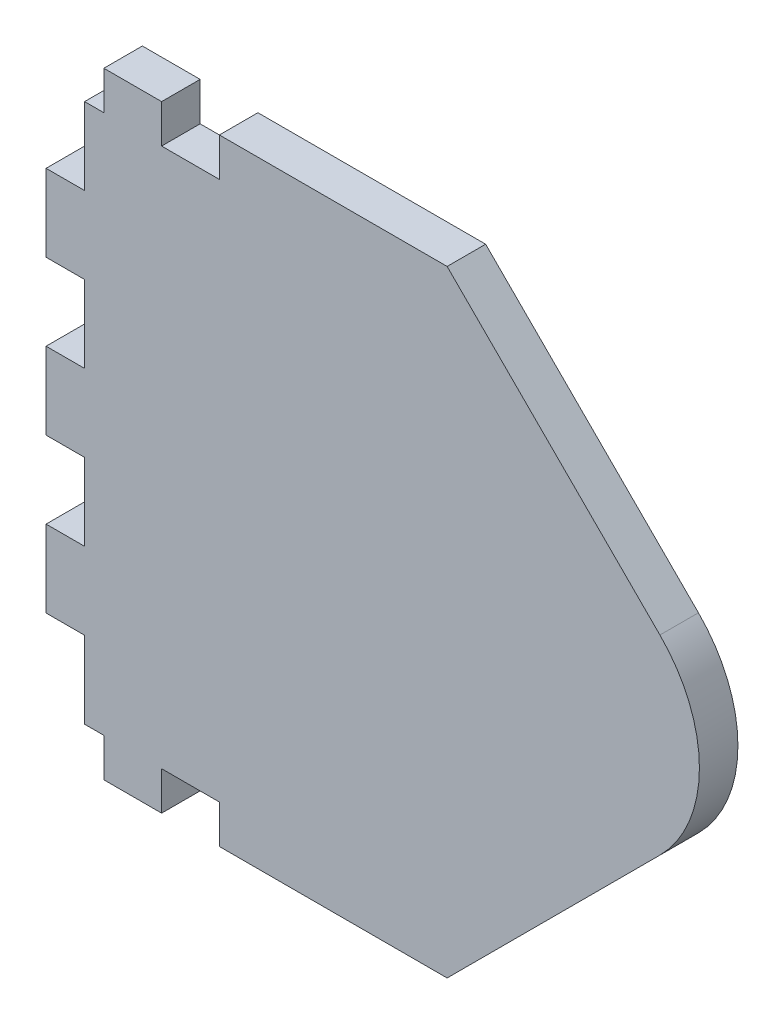
ISO-10303-21;
HEADER;
FILE_DESCRIPTION(('STEP AP214'),'2;1');
FILE_NAME('part.step','',(''),(''),'','','');
FILE_SCHEMA(('AUTOMOTIVE_DESIGN { 1 0 10303 214 1 1 1 1 }'));
ENDSEC;
DATA;
#1=APPLICATION_CONTEXT('core data for automotive mechanical design processes');
#2=APPLICATION_PROTOCOL_DEFINITION('international standard','automotive_design',2000,#1);
#3=PRODUCT_CONTEXT('',#1,'mechanical');
#4=PRODUCT('Part','Part','',(#3));
#5=PRODUCT_RELATED_PRODUCT_CATEGORY('part','',(#4));
#6=PRODUCT_DEFINITION_FORMATION('','',#4);
#7=PRODUCT_DEFINITION_CONTEXT('part definition',#1,'design');
#8=PRODUCT_DEFINITION('design','',#6,#7);
#9=PRODUCT_DEFINITION_SHAPE('','',#8);
#10=(LENGTH_UNIT() NAMED_UNIT(*) SI_UNIT(.MILLI.,.METRE.));
#11=(NAMED_UNIT(*) PLANE_ANGLE_UNIT() SI_UNIT($,.RADIAN.));
#12=(NAMED_UNIT(*) SI_UNIT($,.STERADIAN.) SOLID_ANGLE_UNIT());
#13=UNCERTAINTY_MEASURE_WITH_UNIT(LENGTH_MEASURE(1.E-05),#10,'distance_accuracy_value','');
#14=(GEOMETRIC_REPRESENTATION_CONTEXT(3) GLOBAL_UNCERTAINTY_ASSIGNED_CONTEXT((#13)) GLOBAL_UNIT_ASSIGNED_CONTEXT((#10,
#11,#12)) REPRESENTATION_CONTEXT('',''));
#15=CARTESIAN_POINT('',(0.,0.,0.));
#16=DIRECTION('',(0.,0.,1.));
#17=DIRECTION('',(1.,0.,0.));
#18=AXIS2_PLACEMENT_3D('',#15,#16,#17);
#19=CARTESIAN_POINT('',(-19.049999999964,-37.5475411549447,-6.35));
#20=DIRECTION('',(-1.,0.,0.));
#21=DIRECTION('',(0.,0.,1.));
#22=AXIS2_PLACEMENT_3D('',#19,#20,#21);
#23=PLANE('',#22);
#24=DIRECTION('',(0.,-1.,0.));
#25=VECTOR('',#24,1.);
#26=CARTESIAN_POINT('',(-19.049999999964,-37.5475411549447,0.));
#27=LINE('',#26,#25);
#28=CARTESIAN_POINT('',(-19.0499999978605,-81.9975411549452,0.));
#29=VERTEX_POINT('',#28);
#30=CARTESIAN_POINT('',(-19.0499999978605,-94.6975411549452,0.));
#31=VERTEX_POINT('',#30);
#32=EDGE_CURVE('E311',#29,#31,#27,.T.);
#33=ORIENTED_EDGE('',*,*,#32,.F.);
#34=DIRECTION('',(0.,0.,-1.));
#35=VECTOR('',#34,1.);
#36=CARTESIAN_POINT('',(-19.0499999978605,-81.9975411549452,-12.7));
#37=LINE('',#36,#35);
#38=CARTESIAN_POINT('',(-19.0499999978605,-81.9975411549452,-6.35000000000001));
#39=VERTEX_POINT('',#38);
#40=EDGE_CURVE('E458',#29,#39,#37,.T.);
#41=ORIENTED_EDGE('',*,*,#40,.T.);
#42=DIRECTION('',(0.,-1.,0.));
#43=VECTOR('',#42,1.);
#44=CARTESIAN_POINT('',(-19.049999999964,-37.5475411549447,-6.35));
#45=LINE('',#44,#43);
#46=CARTESIAN_POINT('',(-19.0499999978605,-94.6975411549452,-6.35000000000001));
#47=VERTEX_POINT('',#46);
#48=EDGE_CURVE('E335',#39,#47,#45,.T.);
#49=ORIENTED_EDGE('',*,*,#48,.T.);
#50=DIRECTION('',(0.,0.,1.));
#51=VECTOR('',#50,1.);
#52=CARTESIAN_POINT('',(-19.0499999978605,-94.6975411549452,41.275));
#53=LINE('',#52,#51);
#54=EDGE_CURVE('E440',#47,#31,#53,.T.);
#55=ORIENTED_EDGE('',*,*,#54,.T.);
#56=EDGE_LOOP('',(#33,#41,#49,#55));
#57=FACE_BOUND('',#56,.T.);
#58=ADVANCED_FACE('F33',(#57),#23,.T.);
#59=CARTESIAN_POINT('',(-19.049999999964,-56.5975411549452,0.));
#60=VERTEX_POINT('',#59);
#61=CARTESIAN_POINT('',(-19.0499999978605,-69.2975411549452,0.));
#62=VERTEX_POINT('',#61);
#63=EDGE_CURVE('E313',#60,#62,#27,.T.);
#64=ORIENTED_EDGE('',*,*,#63,.F.);
#65=DIRECTION('',(0.,0.,-1.));
#66=VECTOR('',#65,1.);
#67=CARTESIAN_POINT('',(-19.0499999978605,-56.5975411549452,-12.7));
#68=LINE('',#67,#66);
#69=CARTESIAN_POINT('',(-19.0499999978605,-56.5975411549452,-6.35000000000001));
#70=VERTEX_POINT('',#69);
#71=EDGE_CURVE('E473',#60,#70,#68,.T.);
#72=ORIENTED_EDGE('',*,*,#71,.T.);
#73=CARTESIAN_POINT('',(-19.0499999978605,-69.2975411549452,-6.35000000000001));
#74=VERTEX_POINT('',#73);
#75=EDGE_CURVE('E337',#70,#74,#45,.T.);
#76=ORIENTED_EDGE('',*,*,#75,.T.);
#77=DIRECTION('',(0.,0.,1.));
#78=VECTOR('',#77,1.);
#79=CARTESIAN_POINT('',(-19.0499999978605,-69.2975411549452,41.275));
#80=LINE('',#79,#78);
#81=EDGE_CURVE('E438',#74,#62,#80,.T.);
#82=ORIENTED_EDGE('',*,*,#81,.T.);
#83=EDGE_LOOP('',(#64,#72,#76,#82));
#84=FACE_BOUND('',#83,.T.);
#85=ADVANCED_FACE('F520',(#84),#23,.T.);
#86=CARTESIAN_POINT('',(-19.049999999964,-107.397541154945,0.));
#87=VERTEX_POINT('',#86);
#88=CARTESIAN_POINT('',(-19.0499999978604,-120.097541154945,0.));
#89=VERTEX_POINT('',#88);
#90=EDGE_CURVE('E309',#87,#89,#27,.T.);
#91=ORIENTED_EDGE('',*,*,#90,.F.);
#92=DIRECTION('',(0.,0.,-1.));
#93=VECTOR('',#92,1.);
#94=CARTESIAN_POINT('',(-19.0499999978605,-107.397541154945,-12.7));
#95=LINE('',#94,#93);
#96=CARTESIAN_POINT('',(-19.0499999978605,-107.397541154945,-6.35000000000001));
#97=VERTEX_POINT('',#96);
#98=EDGE_CURVE('E234',#87,#97,#95,.T.);
#99=ORIENTED_EDGE('',*,*,#98,.T.);
#100=CARTESIAN_POINT('',(-19.0499999978604,-120.097541154945,-6.35000000000001));
#101=VERTEX_POINT('',#100);
#102=EDGE_CURVE('E329',#97,#101,#45,.T.);
#103=ORIENTED_EDGE('',*,*,#102,.T.);
#104=DIRECTION('',(0.,0.,1.));
#105=VECTOR('',#104,1.);
#106=CARTESIAN_POINT('',(-19.0499999978604,-120.097541154945,41.275));
#107=LINE('',#106,#105);
#108=EDGE_CURVE('E436',#101,#89,#107,.T.);
#109=ORIENTED_EDGE('',*,*,#108,.T.);
#110=EDGE_LOOP('',(#91,#99,#103,#109));
#111=FACE_BOUND('',#110,.T.);
#112=ADVANCED_FACE('F490',(#111),#23,.T.);
#113=CARTESIAN_POINT('',(-19.049999999964,-37.5475411549447,-6.35));
#114=DIRECTION('',(0.,-1.,0.));
#115=DIRECTION('',(1.,0.,0.));
#116=AXIS2_PLACEMENT_3D('',#113,#114,#115);
#117=PLANE('',#116);
#118=DIRECTION('',(0.,0.,1.));
#119=VECTOR('',#118,1.);
#120=CARTESIAN_POINT('',(9.52499999972772,-37.5475411549448,-6.35000000000001));
#121=LINE('',#120,#119);
#122=CARTESIAN_POINT('',(9.52499999972772,-37.5475411549448,-6.35000000000001));
#123=VERTEX_POINT('',#122);
#124=CARTESIAN_POINT('',(9.52499999972772,-37.5475411549448,0.));
#125=VERTEX_POINT('',#124);
#126=EDGE_CURVE('E409',#123,#125,#121,.T.);
#127=ORIENTED_EDGE('',*,*,#126,.T.);
#128=DIRECTION('',(1.,0.,0.));
#129=VECTOR('',#128,1.);
#130=CARTESIAN_POINT('',(-19.049999999964,-37.5475411549447,0.));
#131=LINE('',#130,#129);
#132=CARTESIAN_POINT('',(47.0725411549534,-37.5475411549446,0.));
#133=VERTEX_POINT('',#132);
#134=EDGE_CURVE('E288',#125,#133,#131,.T.);
#135=ORIENTED_EDGE('',*,*,#134,.T.);
#136=DIRECTION('',(0.,0.,1.));
#137=VECTOR('',#136,1.);
#138=CARTESIAN_POINT('',(47.0725411549534,-37.5475411549446,-6.35));
#139=LINE('',#138,#137);
#140=CARTESIAN_POINT('',(47.0725411549534,-37.5475411549446,-6.35));
#141=VERTEX_POINT('',#140);
#142=EDGE_CURVE('E274',#141,#133,#139,.T.);
#143=ORIENTED_EDGE('',*,*,#142,.F.);
#144=DIRECTION('',(1.,0.,0.));
#145=VECTOR('',#144,1.);
#146=CARTESIAN_POINT('',(-19.049999999964,-37.5475411549447,-6.35));
#147=LINE('',#146,#145);
#148=EDGE_CURVE('E299',#123,#141,#147,.T.);
#149=ORIENTED_EDGE('',*,*,#148,.F.);
#150=EDGE_LOOP('',(#127,#135,#143,#149));
#151=FACE_BOUND('',#150,.T.);
#152=ADVANCED_FACE('F516',(#151),#117,.F.);
#153=DIRECTION('',(0.,0.,-1.));
#154=VECTOR('',#153,1.);
#155=CARTESIAN_POINT('',(-2.72275257895416E-10,-37.5475411549447,-12.7));
#156=LINE('',#155,#154);
#157=CARTESIAN_POINT('',(-2.72289135683224E-10,-37.5475411549447,0.));
#158=VERTEX_POINT('',#157);
#159=CARTESIAN_POINT('',(-2.72275257895416E-10,-37.5475411549447,-6.35000000000001));
#160=VERTEX_POINT('',#159);
#161=EDGE_CURVE('E428',#158,#160,#156,.T.);
#162=ORIENTED_EDGE('',*,*,#161,.T.);
#163=CARTESIAN_POINT('',(-9.52500000027229,-37.5475411549447,-6.35000000000001));
#164=VERTEX_POINT('',#163);
#165=EDGE_CURVE('E293',#164,#160,#147,.T.);
#166=ORIENTED_EDGE('',*,*,#165,.F.);
#167=DIRECTION('',(0.,0.,-1.));
#168=VECTOR('',#167,1.);
#169=CARTESIAN_POINT('',(-9.52500000027231,-37.5475411549447,23.8125));
#170=LINE('',#169,#168);
#171=CARTESIAN_POINT('',(-9.52500000027229,-37.5475411549447,0.));
#172=VERTEX_POINT('',#171);
#173=EDGE_CURVE('E404',#172,#164,#170,.T.);
#174=ORIENTED_EDGE('',*,*,#173,.F.);
#175=EDGE_CURVE('E324',#172,#158,#131,.T.);
#176=ORIENTED_EDGE('',*,*,#175,.T.);
#177=EDGE_LOOP('',(#162,#166,#174,#176));
#178=FACE_BOUND('',#177,.T.);
#179=ADVANCED_FACE('F511',(#178),#117,.F.);
#180=CARTESIAN_POINT('',(-19.049999999964,-139.147541154945,-6.35));
#181=DIRECTION('',(0.,-1.,0.));
#182=DIRECTION('',(1.,0.,0.));
#183=AXIS2_PLACEMENT_3D('',#180,#181,#182);
#184=PLANE('',#183);
#185=DIRECTION('',(1.,0.,0.));
#186=VECTOR('',#185,1.);
#187=CARTESIAN_POINT('',(-19.049999999964,-139.147541154945,0.));
#188=LINE('',#187,#186);
#189=CARTESIAN_POINT('',(9.52499999972763,-139.147541154945,0.));
#190=VERTEX_POINT('',#189);
#191=CARTESIAN_POINT('',(47.0725411549534,-139.147541154945,0.));
#192=VERTEX_POINT('',#191);
#193=EDGE_CURVE('E314',#190,#192,#188,.T.);
#194=ORIENTED_EDGE('',*,*,#193,.F.);
#195=DIRECTION('',(0.,0.,1.));
#196=VECTOR('',#195,1.);
#197=CARTESIAN_POINT('',(9.52499999972763,-139.147541154945,-6.34999999999999));
#198=LINE('',#197,#196);
#199=CARTESIAN_POINT('',(9.52499999972763,-139.147541154945,-6.34999999999999));
#200=VERTEX_POINT('',#199);
#201=EDGE_CURVE('E377',#200,#190,#198,.T.);
#202=ORIENTED_EDGE('',*,*,#201,.F.);
#203=DIRECTION('',(1.,0.,0.));
#204=VECTOR('',#203,1.);
#205=CARTESIAN_POINT('',(-19.049999999964,-139.147541154945,-6.35));
#206=LINE('',#205,#204);
#207=CARTESIAN_POINT('',(47.0725411549534,-139.147541154945,-6.35));
#208=VERTEX_POINT('',#207);
#209=EDGE_CURVE('E345',#200,#208,#206,.T.);
#210=ORIENTED_EDGE('',*,*,#209,.T.);
#211=DIRECTION('',(0.,0.,1.));
#212=VECTOR('',#211,1.);
#213=CARTESIAN_POINT('',(47.0725411549534,-139.147541154945,-6.35));
#214=LINE('',#213,#212);
#215=EDGE_CURVE('E291',#208,#192,#214,.T.);
#216=ORIENTED_EDGE('',*,*,#215,.T.);
#217=EDGE_LOOP('',(#194,#202,#210,#216));
#218=FACE_BOUND('',#217,.T.);
#219=ADVANCED_FACE('F509',(#218),#184,.T.);
#220=CARTESIAN_POINT('',(-9.52500000027237,-139.147541154945,-6.35));
#221=VERTEX_POINT('',#220);
#222=CARTESIAN_POINT('',(-2.72365463516167E-10,-139.147541154945,-6.35));
#223=VERTEX_POINT('',#222);
#224=EDGE_CURVE('E350',#221,#223,#206,.T.);
#225=ORIENTED_EDGE('',*,*,#224,.T.);
#226=DIRECTION('',(0.,0.,-1.));
#227=VECTOR('',#226,1.);
#228=CARTESIAN_POINT('',(-2.72365463516167E-10,-139.147541154945,-12.7));
#229=LINE('',#228,#227);
#230=CARTESIAN_POINT('',(-2.72365463516167E-10,-139.147541154945,0.));
#231=VERTEX_POINT('',#230);
#232=EDGE_CURVE('E399',#231,#223,#229,.T.);
#233=ORIENTED_EDGE('',*,*,#232,.F.);
#234=CARTESIAN_POINT('',(-9.52500000027238,-139.147541154945,0.));
#235=VERTEX_POINT('',#234);
#236=EDGE_CURVE('E316',#235,#231,#188,.T.);
#237=ORIENTED_EDGE('',*,*,#236,.F.);
#238=DIRECTION('',(0.,0.,1.));
#239=VECTOR('',#238,1.);
#240=CARTESIAN_POINT('',(-9.52500000027237,-139.147541154945,-12.7));
#241=LINE('',#240,#239);
#242=EDGE_CURVE('E395',#221,#235,#241,.T.);
#243=ORIENTED_EDGE('',*,*,#242,.F.);
#244=EDGE_LOOP('',(#225,#233,#237,#243));
#245=FACE_BOUND('',#244,.T.);
#246=ADVANCED_FACE('F504',(#245),#184,.T.);
#247=CARTESIAN_POINT('',(66.441644731211,-88.3475411549445,-6.35));
#248=DIRECTION('',(0.,0.,1.));
#249=DIRECTION('',(1.,0.,0.));
#250=AXIS2_PLACEMENT_3D('',#247,#248,#249);
#251=PLANE('',#250);
#252=DIRECTION('',(0.,1.,0.));
#253=VECTOR('',#252,1.);
#254=CARTESIAN_POINT('',(9.52499999972763,-139.147541154945,-6.34999999999999));
#255=LINE('',#254,#253);
#256=CARTESIAN_POINT('',(9.52499999972764,-132.797541154945,-6.34999999999999));
#257=VERTEX_POINT('',#256);
#258=EDGE_CURVE('E372',#200,#257,#255,.T.);
#259=ORIENTED_EDGE('',*,*,#258,.T.);
#260=DIRECTION('',(1.,0.,0.));
#261=VECTOR('',#260,1.);
#262=CARTESIAN_POINT('',(-19.0500000002724,-132.797541154945,-6.35));
#263=LINE('',#262,#261);
#264=CARTESIAN_POINT('',(-2.72358524622263E-10,-132.797541154945,-6.35));
#265=VERTEX_POINT('',#264);
#266=EDGE_CURVE('E374',#265,#257,#263,.T.);
#267=ORIENTED_EDGE('',*,*,#266,.F.);
#268=DIRECTION('',(0.,1.,0.));
#269=VECTOR('',#268,1.);
#270=CARTESIAN_POINT('',(-2.72365463516167E-10,-139.147541154945,-6.34999999999999));
#271=LINE('',#270,#269);
#272=EDGE_CURVE('E386',#223,#265,#271,.T.);
#273=ORIENTED_EDGE('',*,*,#272,.F.);
#274=ORIENTED_EDGE('',*,*,#224,.F.);
#275=DIRECTION('',(0.,-1.,0.));
#276=VECTOR('',#275,1.);
#277=CARTESIAN_POINT('',(-9.52500000027237,-139.147541154945,-6.35));
#278=LINE('',#277,#276);
#279=CARTESIAN_POINT('',(-9.52500000027238,-132.797541154945,-6.35));
#280=VERTEX_POINT('',#279);
#281=EDGE_CURVE('E389',#280,#221,#278,.T.);
#282=ORIENTED_EDGE('',*,*,#281,.F.);
#283=CARTESIAN_POINT('',(-12.6999999978604,-132.797541154945,-6.35));
#284=VERTEX_POINT('',#283);
#285=EDGE_CURVE('E380',#284,#280,#263,.T.);
#286=ORIENTED_EDGE('',*,*,#285,.F.);
#287=DIRECTION('',(0.,1.,0.));
#288=VECTOR('',#287,1.);
#289=CARTESIAN_POINT('',(-12.6999999978604,-139.147541154945,-6.35000000000001));
#290=LINE('',#289,#288);
#291=CARTESIAN_POINT('',(-12.6999999978604,-120.097541154945,-6.35000000000001));
#292=VERTEX_POINT('',#291);
#293=EDGE_CURVE('E443',#284,#292,#290,.T.);
#294=ORIENTED_EDGE('',*,*,#293,.T.);
#295=DIRECTION('',(1.,0.,0.));
#296=VECTOR('',#295,1.);
#297=CARTESIAN_POINT('',(-12.6999999978604,-120.097541154945,-6.35000000000001));
#298=LINE('',#297,#296);
#299=EDGE_CURVE('E239',#101,#292,#298,.T.);
#300=ORIENTED_EDGE('',*,*,#299,.F.);
#301=ORIENTED_EDGE('',*,*,#102,.F.);
#302=DIRECTION('',(-1.,0.,0.));
#303=VECTOR('',#302,1.);
#304=CARTESIAN_POINT('',(-12.6999999978605,-107.397541154945,-6.35000000000001));
#305=LINE('',#304,#303);
#306=CARTESIAN_POINT('',(-12.6999999978605,-107.397541154945,-6.35000000000001));
#307=VERTEX_POINT('',#306);
#308=EDGE_CURVE('E475',#307,#97,#305,.T.);
#309=ORIENTED_EDGE('',*,*,#308,.F.);
#310=CARTESIAN_POINT('',(-12.6999999978605,-94.6975411549452,-6.35000000000001));
#311=VERTEX_POINT('',#310);
#312=EDGE_CURVE('E247',#307,#311,#290,.T.);
#313=ORIENTED_EDGE('',*,*,#312,.T.);
#314=DIRECTION('',(1.,0.,0.));
#315=VECTOR('',#314,1.);
#316=CARTESIAN_POINT('',(-12.6999999978605,-94.6975411549452,-6.35000000000001));
#317=LINE('',#316,#315);
#318=EDGE_CURVE('E450',#47,#311,#317,.T.);
#319=ORIENTED_EDGE('',*,*,#318,.F.);
#320=ORIENTED_EDGE('',*,*,#48,.F.);
#321=DIRECTION('',(-1.,0.,0.));
#322=VECTOR('',#321,1.);
#323=CARTESIAN_POINT('',(-12.6999999978605,-81.9975411549452,-6.35000000000001));
#324=LINE('',#323,#322);
#325=CARTESIAN_POINT('',(-12.6999999978605,-81.9975411549452,-6.35000000000001));
#326=VERTEX_POINT('',#325);
#327=EDGE_CURVE('E447',#326,#39,#324,.T.);
#328=ORIENTED_EDGE('',*,*,#327,.F.);
#329=CARTESIAN_POINT('',(-12.6999999978605,-69.2975411549452,-6.35000000000001));
#330=VERTEX_POINT('',#329);
#331=EDGE_CURVE('E446',#326,#330,#290,.T.);
#332=ORIENTED_EDGE('',*,*,#331,.T.);
#333=DIRECTION('',(1.,0.,0.));
#334=VECTOR('',#333,1.);
#335=CARTESIAN_POINT('',(-12.6999999978605,-69.2975411549452,-6.35000000000001));
#336=LINE('',#335,#334);
#337=EDGE_CURVE('E466',#74,#330,#336,.T.);
#338=ORIENTED_EDGE('',*,*,#337,.F.);
#339=ORIENTED_EDGE('',*,*,#75,.F.);
#340=DIRECTION('',(-1.,0.,0.));
#341=VECTOR('',#340,1.);
#342=CARTESIAN_POINT('',(-12.6999999978605,-56.5975411549452,-6.35000000000001));
#343=LINE('',#342,#341);
#344=CARTESIAN_POINT('',(-12.6999999978605,-56.5975411549452,-6.35000000000001));
#345=VERTEX_POINT('',#344);
#346=EDGE_CURVE('E462',#345,#70,#343,.T.);
#347=ORIENTED_EDGE('',*,*,#346,.F.);
#348=CARTESIAN_POINT('',(-12.6999999978605,-43.8975411549452,-6.35000000000001));
#349=VERTEX_POINT('',#348);
#350=EDGE_CURVE('E449',#345,#349,#290,.T.);
#351=ORIENTED_EDGE('',*,*,#350,.T.);
#352=DIRECTION('',(1.,0.,0.));
#353=VECTOR('',#352,1.);
#354=CARTESIAN_POINT('',(-19.0500000002723,-43.8975411549447,-6.35000000000001));
#355=LINE('',#354,#353);
#356=CARTESIAN_POINT('',(-9.52500000027229,-43.8975411549447,-6.35000000000001));
#357=VERTEX_POINT('',#356);
#358=EDGE_CURVE('E408',#349,#357,#355,.T.);
#359=ORIENTED_EDGE('',*,*,#358,.T.);
#360=DIRECTION('',(0.,-1.,0.));
#361=VECTOR('',#360,1.);
#362=CARTESIAN_POINT('',(-9.52500000027229,-43.8975411549447,-6.35000000000001));
#363=LINE('',#362,#361);
#364=EDGE_CURVE('E419',#164,#357,#363,.T.);
#365=ORIENTED_EDGE('',*,*,#364,.F.);
#366=ORIENTED_EDGE('',*,*,#165,.T.);
#367=DIRECTION('',(0.,1.,0.));
#368=VECTOR('',#367,1.);
#369=CARTESIAN_POINT('',(-2.7228219678932E-10,-43.8975411549447,-6.35));
#370=LINE('',#369,#368);
#371=CARTESIAN_POINT('',(-2.7228219678932E-10,-43.8975411549447,-6.35000000000001));
#372=VERTEX_POINT('',#371);
#373=EDGE_CURVE('E412',#372,#160,#370,.T.);
#374=ORIENTED_EDGE('',*,*,#373,.F.);
#375=CARTESIAN_POINT('',(9.52499999972772,-43.8975411549448,-6.35000000000001));
#376=VERTEX_POINT('',#375);
#377=EDGE_CURVE('E415',#372,#376,#355,.T.);
#378=ORIENTED_EDGE('',*,*,#377,.T.);
#379=DIRECTION('',(0.,1.,0.));
#380=VECTOR('',#379,1.);
#381=CARTESIAN_POINT('',(9.52499999972772,-43.8975411549448,-6.35000000000001));
#382=LINE('',#381,#380);
#383=EDGE_CURVE('E406',#376,#123,#382,.T.);
#384=ORIENTED_EDGE('',*,*,#383,.T.);
#385=ORIENTED_EDGE('',*,*,#148,.T.);
#386=DIRECTION('',(0.707106781186545,-0.70710678118655,0.));
#387=VECTOR('',#386,1.);
#388=CARTESIAN_POINT('',(47.0725411549534,-37.5475411549446,-6.35));
#389=LINE('',#388,#387);
#390=CARTESIAN_POINT('',(82.1570929430826,-72.6320929430741,-6.35));
#391=VERTEX_POINT('',#390);
#392=EDGE_CURVE('E305',#141,#391,#389,.T.);
#393=ORIENTED_EDGE('',*,*,#392,.T.);
#394=CARTESIAN_POINT('',(66.441644731211,-88.3475411549445,-6.35));
#395=DIRECTION('',(0.,0.,1.));
#396=DIRECTION('',(1.,0.,0.));
#397=AXIS2_PLACEMENT_3D('',#394,#395,#396);
#398=CIRCLE('',#397,22.225);
#399=CARTESIAN_POINT('',(82.1570929430821,-104.062989366815,-6.35));
#400=VERTEX_POINT('',#399);
#401=EDGE_CURVE('E357',#400,#391,#398,.T.);
#402=ORIENTED_EDGE('',*,*,#401,.F.);
#403=DIRECTION('',(0.707106781186541,0.707106781186554,0.));
#404=VECTOR('',#403,1.);
#405=CARTESIAN_POINT('',(47.0725411549534,-139.147541154945,-6.35));
#406=LINE('',#405,#404);
#407=EDGE_CURVE('E354',#208,#400,#406,.T.);
#408=ORIENTED_EDGE('',*,*,#407,.F.);
#409=ORIENTED_EDGE('',*,*,#209,.F.);
#410=EDGE_LOOP('',(#259,#267,#273,#274,#282,#286,#294,#300,#301,#309,#313,#319,#320,#328,#332,
#338,#339,#347,#351,#359,#365,#366,#374,#378,#384,#385,#393,#402,#408,#409));
#411=FACE_BOUND('',#410,.T.);
#412=ADVANCED_FACE('F362',(#411),#251,.F.);
#413=CARTESIAN_POINT('',(66.441644731211,-88.3475411549445,0.));
#414=DIRECTION('',(0.,0.,1.));
#415=DIRECTION('',(1.,0.,0.));
#416=AXIS2_PLACEMENT_3D('',#413,#414,#415);
#417=PLANE('',#416);
#418=DIRECTION('',(-1.,0.,0.));
#419=VECTOR('',#418,1.);
#420=CARTESIAN_POINT('',(-12.6999999978604,-120.097541154945,0.));
#421=LINE('',#420,#419);
#422=CARTESIAN_POINT('',(-12.6999999978605,-120.097541154945,0.));
#423=VERTEX_POINT('',#422);
#424=EDGE_CURVE('E240',#423,#89,#421,.T.);
#425=ORIENTED_EDGE('',*,*,#424,.F.);
#426=DIRECTION('',(0.,-1.,0.));
#427=VECTOR('',#426,1.);
#428=CARTESIAN_POINT('',(-12.6999999978605,-88.3475411549446,0.));
#429=LINE('',#428,#427);
#430=CARTESIAN_POINT('',(-12.6999999978604,-132.797541154945,0.));
#431=VERTEX_POINT('',#430);
#432=EDGE_CURVE('E264',#423,#431,#429,.T.);
#433=ORIENTED_EDGE('',*,*,#432,.T.);
#434=DIRECTION('',(1.,0.,0.));
#435=VECTOR('',#434,1.);
#436=CARTESIAN_POINT('',(66.441644731211,-132.797541154945,0.));
#437=LINE('',#436,#435);
#438=CARTESIAN_POINT('',(-9.52500000027237,-132.797541154945,0.));
#439=VERTEX_POINT('',#438);
#440=EDGE_CURVE('E263',#431,#439,#437,.T.);
#441=ORIENTED_EDGE('',*,*,#440,.T.);
#442=DIRECTION('',(0.,1.,0.));
#443=VECTOR('',#442,1.);
#444=CARTESIAN_POINT('',(-9.52500000027238,-139.147541154945,0.));
#445=LINE('',#444,#443);
#446=EDGE_CURVE('E392',#235,#439,#445,.T.);
#447=ORIENTED_EDGE('',*,*,#446,.F.);
#448=ORIENTED_EDGE('',*,*,#236,.T.);
#449=DIRECTION('',(0.,1.,0.));
#450=VECTOR('',#449,1.);
#451=CARTESIAN_POINT('',(-2.72365463516167E-10,-139.147541154945,0.));
#452=LINE('',#451,#450);
#453=CARTESIAN_POINT('',(-2.72361146135585E-10,-132.797541154945,0.));
#454=VERTEX_POINT('',#453);
#455=EDGE_CURVE('E391',#231,#454,#452,.T.);
#456=ORIENTED_EDGE('',*,*,#455,.T.);
#457=CARTESIAN_POINT('',(9.52499999972764,-132.797541154945,0.));
#458=VERTEX_POINT('',#457);
#459=EDGE_CURVE('E40',#454,#458,#437,.T.);
#460=ORIENTED_EDGE('',*,*,#459,.T.);
#461=DIRECTION('',(0.,-1.,0.));
#462=VECTOR('',#461,1.);
#463=CARTESIAN_POINT('',(9.52499999972767,-88.3475411549444,0.));
#464=LINE('',#463,#462);
#465=EDGE_CURVE('E11',#458,#190,#464,.T.);
#466=ORIENTED_EDGE('',*,*,#465,.T.);
#467=ORIENTED_EDGE('',*,*,#193,.T.);
#468=DIRECTION('',(0.707106781186541,0.707106781186554,0.));
#469=VECTOR('',#468,1.);
#470=CARTESIAN_POINT('',(47.0725411549534,-139.147541154945,0.));
#471=LINE('',#470,#469);
#472=CARTESIAN_POINT('',(82.1570929430821,-104.062989366815,0.));
#473=VERTEX_POINT('',#472);
#474=EDGE_CURVE('E317',#192,#473,#471,.T.);
#475=ORIENTED_EDGE('',*,*,#474,.T.);
#476=CARTESIAN_POINT('',(66.441644731211,-88.3475411549445,0.));
#477=DIRECTION('',(0.,0.,1.));
#478=DIRECTION('',(1.,0.,0.));
#479=AXIS2_PLACEMENT_3D('',#476,#477,#478);
#480=CIRCLE('',#479,22.225);
#481=CARTESIAN_POINT('',(82.1570929430826,-72.6320929430741,0.));
#482=VERTEX_POINT('',#481);
#483=EDGE_CURVE('E320',#473,#482,#480,.T.);
#484=ORIENTED_EDGE('',*,*,#483,.T.);
#485=DIRECTION('',(0.707106781186545,-0.70710678118655,0.));
#486=VECTOR('',#485,1.);
#487=CARTESIAN_POINT('',(47.0725411549534,-37.5475411549446,0.));
#488=LINE('',#487,#486);
#489=EDGE_CURVE('E322',#133,#482,#488,.T.);
#490=ORIENTED_EDGE('',*,*,#489,.F.);
#491=ORIENTED_EDGE('',*,*,#134,.F.);
#492=DIRECTION('',(0.,-1.,0.));
#493=VECTOR('',#492,1.);
#494=CARTESIAN_POINT('',(9.52499999972768,-88.3475411549444,0.));
#495=LINE('',#494,#493);
#496=CARTESIAN_POINT('',(9.52499999972772,-43.8975411549448,0.));
#497=VERTEX_POINT('',#496);
#498=EDGE_CURVE('E256',#125,#497,#495,.T.);
#499=ORIENTED_EDGE('',*,*,#498,.T.);
#500=DIRECTION('',(1.,0.,0.));
#501=VECTOR('',#500,1.);
#502=CARTESIAN_POINT('',(66.441644731211,-43.8975411549448,0.));
#503=LINE('',#502,#501);
#504=CARTESIAN_POINT('',(-2.7228219678932E-10,-43.8975411549447,0.));
#505=VERTEX_POINT('',#504);
#506=EDGE_CURVE('E261',#505,#497,#503,.T.);
#507=ORIENTED_EDGE('',*,*,#506,.F.);
#508=DIRECTION('',(0.,1.,0.));
#509=VECTOR('',#508,1.);
#510=CARTESIAN_POINT('',(-2.7228219678932E-10,-43.8975411549447,0.));
#511=LINE('',#510,#509);
#512=EDGE_CURVE('E422',#505,#158,#511,.T.);
#513=ORIENTED_EDGE('',*,*,#512,.T.);
#514=ORIENTED_EDGE('',*,*,#175,.F.);
#515=DIRECTION('',(0.,1.,0.));
#516=VECTOR('',#515,1.);
#517=CARTESIAN_POINT('',(-9.52500000027229,-43.8975411549447,0.));
#518=LINE('',#517,#516);
#519=CARTESIAN_POINT('',(-9.52500000027229,-43.8975411549447,0.));
#520=VERTEX_POINT('',#519);
#521=EDGE_CURVE('E423',#520,#172,#518,.T.);
#522=ORIENTED_EDGE('',*,*,#521,.F.);
#523=CARTESIAN_POINT('',(-12.6999999978603,-43.8975411549452,0.));
#524=VERTEX_POINT('',#523);
#525=EDGE_CURVE('E268',#524,#520,#503,.T.);
#526=ORIENTED_EDGE('',*,*,#525,.F.);
#527=CARTESIAN_POINT('',(-12.6999999978605,-56.5975411549452,0.));
#528=VERTEX_POINT('',#527);
#529=EDGE_CURVE('E259',#524,#528,#429,.T.);
#530=ORIENTED_EDGE('',*,*,#529,.T.);
#531=DIRECTION('',(-1.,0.,0.));
#532=VECTOR('',#531,1.);
#533=CARTESIAN_POINT('',(-12.6999999978605,-56.5975411549452,0.));
#534=LINE('',#533,#532);
#535=EDGE_CURVE('E468',#528,#60,#534,.T.);
#536=ORIENTED_EDGE('',*,*,#535,.T.);
#537=ORIENTED_EDGE('',*,*,#63,.T.);
#538=DIRECTION('',(-1.,0.,0.));
#539=VECTOR('',#538,1.);
#540=CARTESIAN_POINT('',(-12.6999999978605,-69.2975411549452,0.));
#541=LINE('',#540,#539);
#542=CARTESIAN_POINT('',(-12.6999999978605,-69.2975411549452,0.));
#543=VERTEX_POINT('',#542);
#544=EDGE_CURVE('E469',#543,#62,#541,.T.);
#545=ORIENTED_EDGE('',*,*,#544,.F.);
#546=CARTESIAN_POINT('',(-12.6999999978605,-81.9975411549452,0.));
#547=VERTEX_POINT('',#546);
#548=EDGE_CURVE('E257',#543,#547,#429,.T.);
#549=ORIENTED_EDGE('',*,*,#548,.T.);
#550=DIRECTION('',(-1.,0.,0.));
#551=VECTOR('',#550,1.);
#552=CARTESIAN_POINT('',(-12.6999999978605,-81.9975411549452,0.));
#553=LINE('',#552,#551);
#554=EDGE_CURVE('E453',#547,#29,#553,.T.);
#555=ORIENTED_EDGE('',*,*,#554,.T.);
#556=ORIENTED_EDGE('',*,*,#32,.T.);
#557=DIRECTION('',(-1.,0.,0.));
#558=VECTOR('',#557,1.);
#559=CARTESIAN_POINT('',(-12.6999999978605,-94.6975411549452,0.));
#560=LINE('',#559,#558);
#561=CARTESIAN_POINT('',(-12.6999999978605,-94.6975411549452,0.));
#562=VERTEX_POINT('',#561);
#563=EDGE_CURVE('E255',#562,#31,#560,.T.);
#564=ORIENTED_EDGE('',*,*,#563,.F.);
#565=CARTESIAN_POINT('',(-12.6999999978605,-107.397541154945,0.));
#566=VERTEX_POINT('',#565);
#567=EDGE_CURVE('E244',#562,#566,#429,.T.);
#568=ORIENTED_EDGE('',*,*,#567,.T.);
#569=DIRECTION('',(-1.,0.,0.));
#570=VECTOR('',#569,1.);
#571=CARTESIAN_POINT('',(-12.6999999978605,-107.397541154945,0.));
#572=LINE('',#571,#570);
#573=EDGE_CURVE('E228',#566,#87,#572,.T.);
#574=ORIENTED_EDGE('',*,*,#573,.T.);
#575=ORIENTED_EDGE('',*,*,#90,.T.);
#576=EDGE_LOOP('',(#425,#433,#441,#447,#448,#456,#460,#466,#467,#475,#484,#490,#491,#499,#507,
#513,#514,#522,#526,#530,#536,#537,#545,#549,#555,#556,#564,#568,#574,#575));
#577=FACE_BOUND('',#576,.T.);
#578=ADVANCED_FACE('F253',(#577),#417,.T.);
#579=CARTESIAN_POINT('',(47.0725411549534,-37.5475411549446,-6.35));
#580=DIRECTION('',(-0.70710678118655,-0.707106781186545,0.));
#581=DIRECTION('',(0.707106781186545,-0.70710678118655,0.));
#582=AXIS2_PLACEMENT_3D('',#579,#580,#581);
#583=PLANE('',#582);
#584=ORIENTED_EDGE('',*,*,#489,.T.);
#585=DIRECTION('',(0.,0.,1.));
#586=VECTOR('',#585,1.);
#587=CARTESIAN_POINT('',(82.1570929430826,-72.6320929430741,-6.35));
#588=LINE('',#587,#586);
#589=EDGE_CURVE('E278',#391,#482,#588,.T.);
#590=ORIENTED_EDGE('',*,*,#589,.F.);
#591=ORIENTED_EDGE('',*,*,#392,.F.);
#592=ORIENTED_EDGE('',*,*,#142,.T.);
#593=EDGE_LOOP('',(#584,#590,#591,#592));
#594=FACE_BOUND('',#593,.T.);
#595=ADVANCED_FACE('F366',(#594),#583,.F.);
#596=CARTESIAN_POINT('',(66.441644731211,-88.3475411549445,-6.35));
#597=DIRECTION('',(0.,0.,1.));
#598=DIRECTION('',(1.,0.,0.));
#599=AXIS2_PLACEMENT_3D('',#596,#597,#598);
#600=CYLINDRICAL_SURFACE('',#599,22.225);
#601=ORIENTED_EDGE('',*,*,#483,.F.);
#602=DIRECTION('',(0.,0.,1.));
#603=VECTOR('',#602,1.);
#604=CARTESIAN_POINT('',(82.1570929430821,-104.062989366815,-6.35));
#605=LINE('',#604,#603);
#606=EDGE_CURVE('E285',#400,#473,#605,.T.);
#607=ORIENTED_EDGE('',*,*,#606,.F.);
#608=ORIENTED_EDGE('',*,*,#401,.T.);
#609=ORIENTED_EDGE('',*,*,#589,.T.);
#610=EDGE_LOOP('',(#601,#607,#608,#609));
#611=FACE_BOUND('',#610,.T.);
#612=ADVANCED_FACE('F368',(#611),#600,.T.);
#613=CARTESIAN_POINT('',(47.0725411549534,-139.147541154945,-6.35));
#614=DIRECTION('',(0.707106781186554,-0.707106781186541,0.));
#615=DIRECTION('',(0.707106781186541,0.707106781186554,0.));
#616=AXIS2_PLACEMENT_3D('',#613,#614,#615);
#617=PLANE('',#616);
#618=ORIENTED_EDGE('',*,*,#474,.F.);
#619=ORIENTED_EDGE('',*,*,#215,.F.);
#620=ORIENTED_EDGE('',*,*,#407,.T.);
#621=ORIENTED_EDGE('',*,*,#606,.T.);
#622=EDGE_LOOP('',(#618,#619,#620,#621));
#623=FACE_BOUND('',#622,.T.);
#624=ADVANCED_FACE('F370',(#623),#617,.T.);
#625=CARTESIAN_POINT('',(-9.52500000027237,-139.147541154945,-12.7));
#626=DIRECTION('',(-1.,0.,0.));
#627=DIRECTION('',(0.,0.,-1.));
#628=AXIS2_PLACEMENT_3D('',#625,#626,#627);
#629=PLANE('',#628);
#630=DIRECTION('',(0.,0.,-1.));
#631=VECTOR('',#630,1.);
#632=CARTESIAN_POINT('',(-9.5250000002724,-132.797541154945,23.8125));
#633=LINE('',#632,#631);
#634=EDGE_CURVE('E312',#439,#280,#633,.T.);
#635=ORIENTED_EDGE('',*,*,#634,.T.);
#636=ORIENTED_EDGE('',*,*,#281,.T.);
#637=ORIENTED_EDGE('',*,*,#242,.T.);
#638=ORIENTED_EDGE('',*,*,#446,.T.);
#639=EDGE_LOOP('',(#635,#636,#637,#638));
#640=FACE_BOUND('',#639,.T.);
#641=ADVANCED_FACE('F497',(#640),#629,.T.);
#642=CARTESIAN_POINT('',(-12.6999999978604,-120.097541154945,-12.7));
#643=DIRECTION('',(0.,-1.,0.));
#644=DIRECTION('',(1.,0.,0.));
#645=AXIS2_PLACEMENT_3D('',#642,#643,#644);
#646=PLANE('',#645);
#647=ORIENTED_EDGE('',*,*,#108,.F.);
#648=ORIENTED_EDGE('',*,*,#299,.T.);
#649=DIRECTION('',(0.,0.,1.));
#650=VECTOR('',#649,1.);
#651=CARTESIAN_POINT('',(-12.6999999978604,-120.097541154945,-12.7));
#652=LINE('',#651,#650);
#653=EDGE_CURVE('E249',#292,#423,#652,.T.);
#654=ORIENTED_EDGE('',*,*,#653,.T.);
#655=ORIENTED_EDGE('',*,*,#424,.T.);
#656=EDGE_LOOP('',(#647,#648,#654,#655));
#657=FACE_BOUND('',#656,.T.);
#658=ADVANCED_FACE('F484',(#657),#646,.T.);
#659=CARTESIAN_POINT('',(-12.6999999978606,31.1975411551724,41.275));
#660=DIRECTION('',(-1.,0.,0.));
#661=DIRECTION('',(0.,0.,1.));
#662=AXIS2_PLACEMENT_3D('',#659,#660,#661);
#663=PLANE('',#662);
#664=ORIENTED_EDGE('',*,*,#653,.F.);
#665=ORIENTED_EDGE('',*,*,#293,.F.);
#666=DIRECTION('',(0.,0.,-1.));
#667=VECTOR('',#666,1.);
#668=CARTESIAN_POINT('',(-12.6999999978604,-132.797541154945,23.8125));
#669=LINE('',#668,#667);
#670=EDGE_CURVE('E400',#431,#284,#669,.T.);
#671=ORIENTED_EDGE('',*,*,#670,.F.);
#672=ORIENTED_EDGE('',*,*,#432,.F.);
#673=EDGE_LOOP('',(#664,#665,#671,#672));
#674=FACE_BOUND('',#673,.T.);
#675=ADVANCED_FACE('F489',(#674),#663,.T.);
#676=CARTESIAN_POINT('',(-31.7500000002724,-132.797541154945,23.8125));
#677=DIRECTION('',(0.,-1.,0.));
#678=DIRECTION('',(1.,0.,0.));
#679=AXIS2_PLACEMENT_3D('',#676,#677,#678);
#680=PLANE('',#679);
#681=ORIENTED_EDGE('',*,*,#670,.T.);
#682=ORIENTED_EDGE('',*,*,#285,.T.);
#683=ORIENTED_EDGE('',*,*,#634,.F.);
#684=ORIENTED_EDGE('',*,*,#440,.F.);
#685=EDGE_LOOP('',(#681,#682,#683,#684));
#686=FACE_BOUND('',#685,.T.);
#687=ADVANCED_FACE('F495',(#686),#680,.T.);
#688=CARTESIAN_POINT('',(-12.6999999978605,-107.397541154945,-12.7));
#689=DIRECTION('',(0.,1.,0.));
#690=DIRECTION('',(-1.,0.,0.));
#691=AXIS2_PLACEMENT_3D('',#688,#689,#690);
#692=PLANE('',#691);
#693=DIRECTION('',(0.,0.,-1.));
#694=VECTOR('',#693,1.);
#695=CARTESIAN_POINT('',(-12.6999999978605,-107.397541154945,-12.7));
#696=LINE('',#695,#694);
#697=EDGE_CURVE('E231',#566,#307,#696,.T.);
#698=ORIENTED_EDGE('',*,*,#697,.T.);
#699=ORIENTED_EDGE('',*,*,#308,.T.);
#700=ORIENTED_EDGE('',*,*,#98,.F.);
#701=ORIENTED_EDGE('',*,*,#573,.F.);
#702=EDGE_LOOP('',(#698,#699,#700,#701));
#703=FACE_BOUND('',#702,.T.);
#704=ADVANCED_FACE('F230',(#703),#692,.T.);
#705=CARTESIAN_POINT('',(-12.6999999978605,-94.6975411549452,-12.7));
#706=DIRECTION('',(0.,-1.,0.));
#707=DIRECTION('',(1.,0.,0.));
#708=AXIS2_PLACEMENT_3D('',#705,#706,#707);
#709=PLANE('',#708);
#710=ORIENTED_EDGE('',*,*,#54,.F.);
#711=ORIENTED_EDGE('',*,*,#318,.T.);
#712=DIRECTION('',(0.,0.,1.));
#713=VECTOR('',#712,1.);
#714=CARTESIAN_POINT('',(-12.6999999978605,-94.6975411549452,-12.7));
#715=LINE('',#714,#713);
#716=EDGE_CURVE('E461',#311,#562,#715,.T.);
#717=ORIENTED_EDGE('',*,*,#716,.T.);
#718=ORIENTED_EDGE('',*,*,#563,.T.);
#719=EDGE_LOOP('',(#710,#711,#717,#718));
#720=FACE_BOUND('',#719,.T.);
#721=ADVANCED_FACE('F646',(#720),#709,.T.);
#722=ORIENTED_EDGE('',*,*,#716,.F.);
#723=ORIENTED_EDGE('',*,*,#312,.F.);
#724=ORIENTED_EDGE('',*,*,#697,.F.);
#725=ORIENTED_EDGE('',*,*,#567,.F.);
#726=EDGE_LOOP('',(#722,#723,#724,#725));
#727=FACE_BOUND('',#726,.T.);
#728=ADVANCED_FACE('F243',(#727),#663,.T.);
#729=CARTESIAN_POINT('',(-12.6999999978605,-81.9975411549452,-12.7));
#730=DIRECTION('',(0.,1.,0.));
#731=DIRECTION('',(-1.,0.,0.));
#732=AXIS2_PLACEMENT_3D('',#729,#730,#731);
#733=PLANE('',#732);
#734=DIRECTION('',(0.,0.,-1.));
#735=VECTOR('',#734,1.);
#736=CARTESIAN_POINT('',(-12.6999999978605,-81.9975411549452,-12.7));
#737=LINE('',#736,#735);
#738=EDGE_CURVE('E455',#547,#326,#737,.T.);
#739=ORIENTED_EDGE('',*,*,#738,.T.);
#740=ORIENTED_EDGE('',*,*,#327,.T.);
#741=ORIENTED_EDGE('',*,*,#40,.F.);
#742=ORIENTED_EDGE('',*,*,#554,.F.);
#743=EDGE_LOOP('',(#739,#740,#741,#742));
#744=FACE_BOUND('',#743,.T.);
#745=ADVANCED_FACE('F662',(#744),#733,.T.);
#746=CARTESIAN_POINT('',(-12.6999999978605,-69.2975411549452,-12.7));
#747=DIRECTION('',(0.,-1.,0.));
#748=DIRECTION('',(1.,0.,0.));
#749=AXIS2_PLACEMENT_3D('',#746,#747,#748);
#750=PLANE('',#749);
#751=ORIENTED_EDGE('',*,*,#81,.F.);
#752=ORIENTED_EDGE('',*,*,#337,.T.);
#753=DIRECTION('',(0.,0.,1.));
#754=VECTOR('',#753,1.);
#755=CARTESIAN_POINT('',(-12.6999999978605,-69.2975411549452,-12.7));
#756=LINE('',#755,#754);
#757=EDGE_CURVE('E55',#330,#543,#756,.T.);
#758=ORIENTED_EDGE('',*,*,#757,.T.);
#759=ORIENTED_EDGE('',*,*,#544,.T.);
#760=EDGE_LOOP('',(#751,#752,#758,#759));
#761=FACE_BOUND('',#760,.T.);
#762=ADVANCED_FACE('F670',(#761),#750,.T.);
#763=ORIENTED_EDGE('',*,*,#757,.F.);
#764=ORIENTED_EDGE('',*,*,#331,.F.);
#765=ORIENTED_EDGE('',*,*,#738,.F.);
#766=ORIENTED_EDGE('',*,*,#548,.F.);
#767=EDGE_LOOP('',(#763,#764,#765,#766));
#768=FACE_BOUND('',#767,.T.);
#769=ADVANCED_FACE('F663',(#768),#663,.T.);
#770=CARTESIAN_POINT('',(-12.6999999978605,-56.5975411549452,-12.7));
#771=DIRECTION('',(0.,1.,0.));
#772=DIRECTION('',(-1.,0.,0.));
#773=AXIS2_PLACEMENT_3D('',#770,#771,#772);
#774=PLANE('',#773);
#775=DIRECTION('',(0.,0.,-1.));
#776=VECTOR('',#775,1.);
#777=CARTESIAN_POINT('',(-12.6999999978605,-56.5975411549452,-12.7));
#778=LINE('',#777,#776);
#779=EDGE_CURVE('E471',#528,#345,#778,.T.);
#780=ORIENTED_EDGE('',*,*,#779,.T.);
#781=ORIENTED_EDGE('',*,*,#346,.T.);
#782=ORIENTED_EDGE('',*,*,#71,.F.);
#783=ORIENTED_EDGE('',*,*,#535,.F.);
#784=EDGE_LOOP('',(#780,#781,#782,#783));
#785=FACE_BOUND('',#784,.T.);
#786=ADVANCED_FACE('F686',(#785),#774,.T.);
#787=CARTESIAN_POINT('',(-9.52500000027228,-43.8975411549447,-12.7));
#788=DIRECTION('',(-1.,0.,0.));
#789=DIRECTION('',(0.,0.,-1.));
#790=AXIS2_PLACEMENT_3D('',#787,#788,#789);
#791=PLANE('',#790);
#792=ORIENTED_EDGE('',*,*,#173,.T.);
#793=ORIENTED_EDGE('',*,*,#364,.T.);
#794=DIRECTION('',(0.,0.,1.));
#795=VECTOR('',#794,1.);
#796=CARTESIAN_POINT('',(-9.52500000027228,-43.8975411549447,-12.7));
#797=LINE('',#796,#795);
#798=EDGE_CURVE('E425',#357,#520,#797,.T.);
#799=ORIENTED_EDGE('',*,*,#798,.T.);
#800=ORIENTED_EDGE('',*,*,#521,.T.);
#801=EDGE_LOOP('',(#792,#793,#799,#800));
#802=FACE_BOUND('',#801,.T.);
#803=ADVANCED_FACE('F694',(#802),#791,.T.);
#804=CARTESIAN_POINT('',(-31.7500000002723,-43.8975411549447,23.8125));
#805=DIRECTION('',(0.,-1.,0.));
#806=DIRECTION('',(1.,0.,0.));
#807=AXIS2_PLACEMENT_3D('',#804,#805,#806);
#808=PLANE('',#807);
#809=ORIENTED_EDGE('',*,*,#525,.T.);
#810=ORIENTED_EDGE('',*,*,#798,.F.);
#811=ORIENTED_EDGE('',*,*,#358,.F.);
#812=DIRECTION('',(0.,0.,-1.));
#813=VECTOR('',#812,1.);
#814=CARTESIAN_POINT('',(-12.6999999978603,-43.8975411549452,41.275));
#815=LINE('',#814,#813);
#816=EDGE_CURVE('E431',#524,#349,#815,.T.);
#817=ORIENTED_EDGE('',*,*,#816,.F.);
#818=EDGE_LOOP('',(#809,#810,#811,#817));
#819=FACE_BOUND('',#818,.T.);
#820=ADVANCED_FACE('F703',(#819),#808,.F.);
#821=ORIENTED_EDGE('',*,*,#816,.T.);
#822=ORIENTED_EDGE('',*,*,#350,.F.);
#823=ORIENTED_EDGE('',*,*,#779,.F.);
#824=ORIENTED_EDGE('',*,*,#529,.F.);
#825=EDGE_LOOP('',(#821,#822,#823,#824));
#826=FACE_BOUND('',#825,.T.);
#827=ADVANCED_FACE('F634',(#826),#663,.T.);
#828=CARTESIAN_POINT('',(9.52499999972772,-43.8975411549448,-6.35000000000001));
#829=DIRECTION('',(-1.,0.,0.));
#830=DIRECTION('',(0.,-1.,0.));
#831=AXIS2_PLACEMENT_3D('',#828,#829,#830);
#832=PLANE('',#831);
#833=ORIENTED_EDGE('',*,*,#126,.F.);
#834=ORIENTED_EDGE('',*,*,#383,.F.);
#835=DIRECTION('',(0.,0.,1.));
#836=VECTOR('',#835,1.);
#837=CARTESIAN_POINT('',(9.52499999972772,-43.8975411549448,-6.35000000000001));
#838=LINE('',#837,#836);
#839=EDGE_CURVE('E411',#376,#497,#838,.T.);
#840=ORIENTED_EDGE('',*,*,#839,.T.);
#841=ORIENTED_EDGE('',*,*,#498,.F.);
#842=EDGE_LOOP('',(#833,#834,#840,#841));
#843=FACE_BOUND('',#842,.T.);
#844=ADVANCED_FACE('F549',(#843),#832,.T.);
#845=CARTESIAN_POINT('',(-2.7228219678932E-10,-43.8975411549447,-12.7));
#846=DIRECTION('',(1.,0.,0.));
#847=DIRECTION('',(0.,1.,0.));
#848=AXIS2_PLACEMENT_3D('',#845,#846,#847);
#849=PLANE('',#848);
#850=DIRECTION('',(0.,0.,-1.));
#851=VECTOR('',#850,1.);
#852=CARTESIAN_POINT('',(-2.7228219678932E-10,-43.8975411549447,-12.7));
#853=LINE('',#852,#851);
#854=EDGE_CURVE('E430',#505,#372,#853,.T.);
#855=ORIENTED_EDGE('',*,*,#854,.T.);
#856=ORIENTED_EDGE('',*,*,#373,.T.);
#857=ORIENTED_EDGE('',*,*,#161,.F.);
#858=ORIENTED_EDGE('',*,*,#512,.F.);
#859=EDGE_LOOP('',(#855,#856,#857,#858));
#860=FACE_BOUND('',#859,.T.);
#861=ADVANCED_FACE('F727',(#860),#849,.T.);
#862=ORIENTED_EDGE('',*,*,#506,.T.);
#863=ORIENTED_EDGE('',*,*,#839,.F.);
#864=ORIENTED_EDGE('',*,*,#377,.F.);
#865=ORIENTED_EDGE('',*,*,#854,.F.);
#866=EDGE_LOOP('',(#862,#863,#864,#865));
#867=FACE_BOUND('',#866,.T.);
#868=ADVANCED_FACE('F713',(#867),#808,.F.);
#869=DIRECTION('',(0.,0.,-1.));
#870=VECTOR('',#869,1.);
#871=CARTESIAN_POINT('',(-2.72358524622263E-10,-132.797541154945,-12.7));
#872=LINE('',#871,#870);
#873=EDGE_CURVE('E47',#454,#265,#872,.T.);
#874=ORIENTED_EDGE('',*,*,#873,.T.);
#875=ORIENTED_EDGE('',*,*,#266,.T.);
#876=DIRECTION('',(0.,0.,1.));
#877=VECTOR('',#876,1.);
#878=CARTESIAN_POINT('',(9.52499999972764,-132.797541154945,-6.34999999999999));
#879=LINE('',#878,#877);
#880=EDGE_CURVE('E384',#257,#458,#879,.T.);
#881=ORIENTED_EDGE('',*,*,#880,.T.);
#882=ORIENTED_EDGE('',*,*,#459,.F.);
#883=EDGE_LOOP('',(#874,#875,#881,#882));
#884=FACE_BOUND('',#883,.T.);
#885=ADVANCED_FACE('F507',(#884),#680,.T.);
#886=CARTESIAN_POINT('',(9.52499999972763,-139.147541154945,-6.34999999999999));
#887=DIRECTION('',(-1.,0.,0.));
#888=DIRECTION('',(0.,-1.,0.));
#889=AXIS2_PLACEMENT_3D('',#886,#887,#888);
#890=PLANE('',#889);
#891=ORIENTED_EDGE('',*,*,#880,.F.);
#892=ORIENTED_EDGE('',*,*,#258,.F.);
#893=ORIENTED_EDGE('',*,*,#201,.T.);
#894=ORIENTED_EDGE('',*,*,#465,.F.);
#895=EDGE_LOOP('',(#891,#892,#893,#894));
#896=FACE_BOUND('',#895,.T.);
#897=ADVANCED_FACE('F508',(#896),#890,.T.);
#898=CARTESIAN_POINT('',(-2.72365463516167E-10,-139.147541154945,-12.7));
#899=DIRECTION('',(1.,0.,0.));
#900=DIRECTION('',(0.,1.,0.));
#901=AXIS2_PLACEMENT_3D('',#898,#899,#900);
#902=PLANE('',#901);
#903=ORIENTED_EDGE('',*,*,#232,.T.);
#904=ORIENTED_EDGE('',*,*,#272,.T.);
#905=ORIENTED_EDGE('',*,*,#873,.F.);
#906=ORIENTED_EDGE('',*,*,#455,.F.);
#907=EDGE_LOOP('',(#903,#904,#905,#906));
#908=FACE_BOUND('',#907,.T.);
#909=ADVANCED_FACE('F505',(#908),#902,.T.);
#910=CLOSED_SHELL('',(#58,#85,#112,#152,#179,#219,#246,#412,#578,#595,#612,#624,#641,#658,#675,
#687,#704,#721,#728,#745,#762,#769,#786,#803,#820,#827,#844,#861,#868,#885,#897,#909));
#911=MANIFOLD_SOLID_BREP('B2',#910);
#912=ADVANCED_BREP_SHAPE_REPRESENTATION('',(#18,#911),#14);
#913=SHAPE_DEFINITION_REPRESENTATION(#9,#912);
ENDSEC;
END-ISO-10303-21;
